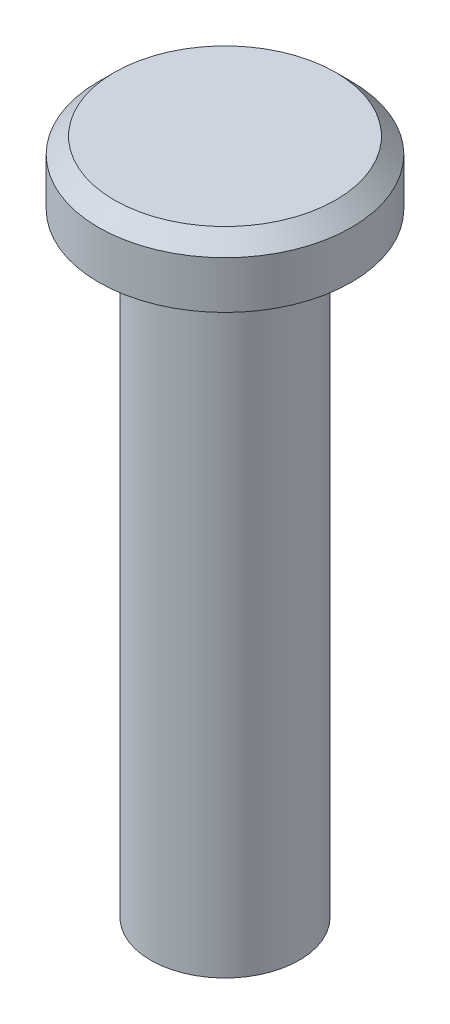
ISO-10303-21;
HEADER;
FILE_DESCRIPTION(('STEP AP214'),'2;1');
FILE_NAME('part.step','',(''),(''),'','','');
FILE_SCHEMA(('AUTOMOTIVE_DESIGN { 1 0 10303 214 1 1 1 1 }'));
ENDSEC;
DATA;
#1=APPLICATION_CONTEXT('core data for automotive mechanical design processes');
#2=APPLICATION_PROTOCOL_DEFINITION('international standard','automotive_design',2000,#1);
#3=PRODUCT_CONTEXT('',#1,'mechanical');
#4=PRODUCT('Part','Part','',(#3));
#5=PRODUCT_RELATED_PRODUCT_CATEGORY('part','',(#4));
#6=PRODUCT_DEFINITION_FORMATION('','',#4);
#7=PRODUCT_DEFINITION_CONTEXT('part definition',#1,'design');
#8=PRODUCT_DEFINITION('design','',#6,#7);
#9=PRODUCT_DEFINITION_SHAPE('','',#8);
#10=(LENGTH_UNIT() NAMED_UNIT(*) SI_UNIT(.MILLI.,.METRE.));
#11=(NAMED_UNIT(*) PLANE_ANGLE_UNIT() SI_UNIT($,.RADIAN.));
#12=(NAMED_UNIT(*) SI_UNIT($,.STERADIAN.) SOLID_ANGLE_UNIT());
#13=UNCERTAINTY_MEASURE_WITH_UNIT(LENGTH_MEASURE(1.E-05),#10,'distance_accuracy_value','');
#14=(GEOMETRIC_REPRESENTATION_CONTEXT(3) GLOBAL_UNCERTAINTY_ASSIGNED_CONTEXT((#13)) GLOBAL_UNIT_ASSIGNED_CONTEXT((#10,
#11,#12)) REPRESENTATION_CONTEXT('',''));
#15=CARTESIAN_POINT('',(0.,0.,0.));
#16=DIRECTION('',(0.,0.,1.));
#17=DIRECTION('',(1.,0.,0.));
#18=AXIS2_PLACEMENT_3D('',#15,#16,#17);
#19=CARTESIAN_POINT('',(0.,19.4,0.));
#20=DIRECTION('',(0.,-1.,0.));
#21=DIRECTION('',(0.,0.,-1.));
#22=AXIS2_PLACEMENT_3D('',#19,#20,#21);
#23=CYLINDRICAL_SURFACE('',#22,2.35);
#24=CARTESIAN_POINT('',(0.,19.4,0.));
#25=DIRECTION('',(0.,1.,0.));
#26=DIRECTION('',(0.,0.,1.));
#27=AXIS2_PLACEMENT_3D('',#24,#25,#26);
#28=CIRCLE('',#27,2.35);
#29=CARTESIAN_POINT('',(0.,19.4,2.35));
#30=VERTEX_POINT('',#29);
#31=EDGE_CURVE('E44',#30,#30,#28,.T.);
#32=ORIENTED_EDGE('',*,*,#31,.F.);
#33=EDGE_LOOP('',(#32));
#34=FACE_BOUND('',#33,.T.);
#35=CARTESIAN_POINT('',(0.,0.,0.));
#36=DIRECTION('',(0.,1.,0.));
#37=DIRECTION('',(0.,0.,1.));
#38=AXIS2_PLACEMENT_3D('',#35,#36,#37);
#39=CIRCLE('',#38,2.35);
#40=CARTESIAN_POINT('',(0.,0.,2.35));
#41=VERTEX_POINT('',#40);
#42=EDGE_CURVE('E48',#41,#41,#39,.T.);
#43=ORIENTED_EDGE('',*,*,#42,.T.);
#44=EDGE_LOOP('',(#43));
#45=FACE_BOUND('',#44,.T.);
#46=ADVANCED_FACE('F32',(#34,#45),#23,.T.);
#47=CARTESIAN_POINT('',(0.,0.,0.));
#48=DIRECTION('',(0.,1.,0.));
#49=DIRECTION('',(0.,0.,1.));
#50=AXIS2_PLACEMENT_3D('',#47,#48,#49);
#51=PLANE('',#50);
#52=CARTESIAN_POINT('',(0.,0.,0.));
#53=DIRECTION('',(0.,-1.,0.));
#54=DIRECTION('',(0.,0.,-1.));
#55=AXIS2_PLACEMENT_3D('',#52,#53,#54);
#56=CIRCLE('',#55,1.5);
#57=CARTESIAN_POINT('',(0.,0.,-1.5));
#58=VERTEX_POINT('',#57);
#59=EDGE_CURVE('E57',#58,#58,#56,.T.);
#60=ORIENTED_EDGE('',*,*,#59,.F.);
#61=EDGE_LOOP('',(#60));
#62=FACE_BOUND('',#61,.T.);
#63=ORIENTED_EDGE('',*,*,#42,.F.);
#64=EDGE_LOOP('',(#63));
#65=FACE_BOUND('',#64,.T.);
#66=ADVANCED_FACE('F71',(#62,#65),#51,.F.);
#67=CARTESIAN_POINT('',(0.,21.4,0.));
#68=DIRECTION('',(0.,-1.,0.));
#69=DIRECTION('',(0.,0.,-1.));
#70=AXIS2_PLACEMENT_3D('',#67,#68,#69);
#71=CYLINDRICAL_SURFACE('',#70,4.);
#72=CARTESIAN_POINT('',(0.,20.9,0.));
#73=DIRECTION('',(0.,1.,0.));
#74=DIRECTION('',(0.,0.,1.));
#75=AXIS2_PLACEMENT_3D('',#72,#73,#74);
#76=CIRCLE('',#75,4.);
#77=CARTESIAN_POINT('',(0.,20.9,4.));
#78=VERTEX_POINT('',#77);
#79=EDGE_CURVE('E10',#78,#78,#76,.F.);
#80=ORIENTED_EDGE('',*,*,#79,.T.);
#81=EDGE_LOOP('',(#80));
#82=FACE_BOUND('',#81,.T.);
#83=CARTESIAN_POINT('',(0.,19.4,0.));
#84=DIRECTION('',(0.,1.,0.));
#85=DIRECTION('',(0.,0.,1.));
#86=AXIS2_PLACEMENT_3D('',#83,#84,#85);
#87=CIRCLE('',#86,4.);
#88=CARTESIAN_POINT('',(0.,19.4,4.));
#89=VERTEX_POINT('',#88);
#90=EDGE_CURVE('E52',#89,#89,#87,.T.);
#91=ORIENTED_EDGE('',*,*,#90,.T.);
#92=EDGE_LOOP('',(#91));
#93=FACE_BOUND('',#92,.T.);
#94=ADVANCED_FACE('F74',(#82,#93),#71,.T.);
#95=CARTESIAN_POINT('',(0.,21.4,0.));
#96=DIRECTION('',(0.,1.,0.));
#97=DIRECTION('',(0.,0.,1.));
#98=AXIS2_PLACEMENT_3D('',#95,#96,#97);
#99=PLANE('',#98);
#100=CARTESIAN_POINT('',(0.,21.4,0.));
#101=DIRECTION('',(0.,1.,0.));
#102=DIRECTION('',(0.,0.,1.));
#103=AXIS2_PLACEMENT_3D('',#100,#101,#102);
#104=CIRCLE('',#103,3.5);
#105=CARTESIAN_POINT('',(0.,21.4,3.5));
#106=VERTEX_POINT('',#105);
#107=EDGE_CURVE('E40',#106,#106,#104,.T.);
#108=ORIENTED_EDGE('',*,*,#107,.T.);
#109=EDGE_LOOP('',(#108));
#110=FACE_BOUND('',#109,.T.);
#111=ADVANCED_FACE('F86',(#110),#99,.T.);
#112=CARTESIAN_POINT('',(0.,19.4,0.));
#113=DIRECTION('',(0.,1.,0.));
#114=DIRECTION('',(0.,0.,1.));
#115=AXIS2_PLACEMENT_3D('',#112,#113,#114);
#116=PLANE('',#115);
#117=ORIENTED_EDGE('',*,*,#31,.T.);
#118=EDGE_LOOP('',(#117));
#119=FACE_BOUND('',#118,.T.);
#120=ORIENTED_EDGE('',*,*,#90,.F.);
#121=EDGE_LOOP('',(#120));
#122=FACE_BOUND('',#121,.T.);
#123=ADVANCED_FACE('F87',(#119,#122),#116,.F.);
#124=CARTESIAN_POINT('',(0.,21.4,0.));
#125=DIRECTION('',(0.,-1.,0.));
#126=DIRECTION('',(0.,0.,-1.));
#127=AXIS2_PLACEMENT_3D('',#124,#125,#126);
#128=CONICAL_SURFACE('',#127,3.5,0.785398163397448);
#129=ORIENTED_EDGE('',*,*,#79,.F.);
#130=EDGE_LOOP('',(#129));
#131=FACE_BOUND('',#130,.T.);
#132=ORIENTED_EDGE('',*,*,#107,.F.);
#133=EDGE_LOOP('',(#132));
#134=FACE_BOUND('',#133,.T.);
#135=ADVANCED_FACE('F35',(#131,#134),#128,.T.);
#136=CARTESIAN_POINT('',(0.,4.,0.));
#137=DIRECTION('',(0.,-1.,0.));
#138=DIRECTION('',(0.,0.,-1.));
#139=AXIS2_PLACEMENT_3D('',#136,#137,#138);
#140=CYLINDRICAL_SURFACE('',#139,1.5);
#141=CARTESIAN_POINT('',(0.,4.,0.));
#142=DIRECTION('',(0.,-1.,0.));
#143=DIRECTION('',(0.,0.,-1.));
#144=AXIS2_PLACEMENT_3D('',#141,#142,#143);
#145=CIRCLE('',#144,1.5);
#146=CARTESIAN_POINT('',(0.,4.,-1.5));
#147=VERTEX_POINT('',#146);
#148=EDGE_CURVE('E56',#147,#147,#145,.T.);
#149=ORIENTED_EDGE('',*,*,#148,.F.);
#150=EDGE_LOOP('',(#149));
#151=FACE_BOUND('',#150,.T.);
#152=ORIENTED_EDGE('',*,*,#59,.T.);
#153=EDGE_LOOP('',(#152));
#154=FACE_BOUND('',#153,.T.);
#155=ADVANCED_FACE('F65',(#151,#154),#140,.F.);
#156=CARTESIAN_POINT('',(0.,4.,0.));
#157=DIRECTION('',(0.,-1.,0.));
#158=DIRECTION('',(0.,0.,-1.));
#159=AXIS2_PLACEMENT_3D('',#156,#157,#158);
#160=PLANE('',#159);
#161=ORIENTED_EDGE('',*,*,#148,.T.);
#162=EDGE_LOOP('',(#161));
#163=FACE_BOUND('',#162,.T.);
#164=ADVANCED_FACE('F63',(#163),#160,.T.);
#165=CLOSED_SHELL('',(#46,#66,#94,#111,#123,#135,#155,#164));
#166=MANIFOLD_SOLID_BREP('B2',#165);
#167=ADVANCED_BREP_SHAPE_REPRESENTATION('',(#18,#166),#14);
#168=SHAPE_DEFINITION_REPRESENTATION(#9,#167);
ENDSEC;
END-ISO-10303-21;
